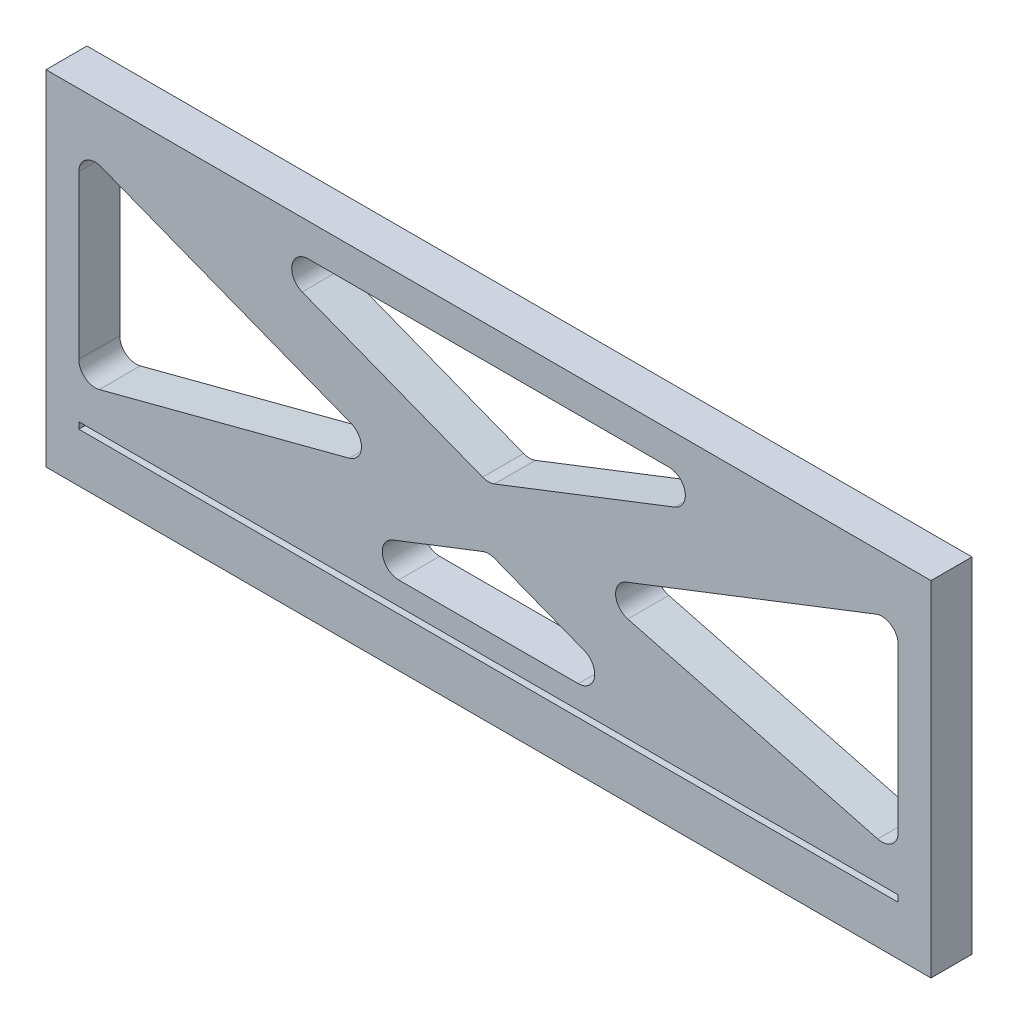
ISO-10303-21;
HEADER;
FILE_DESCRIPTION(('STEP AP214'),'2;1');
FILE_NAME('part.step','',(''),(''),'','','');
FILE_SCHEMA(('AUTOMOTIVE_DESIGN { 1 0 10303 214 1 1 1 1 }'));
ENDSEC;
DATA;
#1=APPLICATION_CONTEXT('core data for automotive mechanical design processes');
#2=APPLICATION_PROTOCOL_DEFINITION('international standard','automotive_design',2000,#1);
#3=PRODUCT_CONTEXT('',#1,'mechanical');
#4=PRODUCT('Part','Part','',(#3));
#5=PRODUCT_RELATED_PRODUCT_CATEGORY('part','',(#4));
#6=PRODUCT_DEFINITION_FORMATION('','',#4);
#7=PRODUCT_DEFINITION_CONTEXT('part definition',#1,'design');
#8=PRODUCT_DEFINITION('design','',#6,#7);
#9=PRODUCT_DEFINITION_SHAPE('','',#8);
#10=(LENGTH_UNIT() NAMED_UNIT(*) SI_UNIT(.MILLI.,.METRE.));
#11=(NAMED_UNIT(*) PLANE_ANGLE_UNIT() SI_UNIT($,.RADIAN.));
#12=(NAMED_UNIT(*) SI_UNIT($,.STERADIAN.) SOLID_ANGLE_UNIT());
#13=UNCERTAINTY_MEASURE_WITH_UNIT(LENGTH_MEASURE(1.E-05),#10,'distance_accuracy_value','');
#14=(GEOMETRIC_REPRESENTATION_CONTEXT(3) GLOBAL_UNCERTAINTY_ASSIGNED_CONTEXT((#13)) GLOBAL_UNIT_ASSIGNED_CONTEXT((#10,
#11,#12)) REPRESENTATION_CONTEXT('',''));
#15=CARTESIAN_POINT('',(0.,0.,0.));
#16=DIRECTION('',(0.,0.,1.));
#17=DIRECTION('',(1.,0.,0.));
#18=AXIS2_PLACEMENT_3D('',#15,#16,#17);
#19=CARTESIAN_POINT('',(0.,0.,3.175));
#20=DIRECTION('',(0.,0.,-1.));
#21=DIRECTION('',(-1.,0.,0.));
#22=AXIS2_PLACEMENT_3D('',#19,#20,#21);
#23=PLANE('',#22);
#24=DIRECTION('',(0.967324913635253,-0.253539960283485,0.));
#25=VECTOR('',#24,1.);
#26=CARTESIAN_POINT('',(31.75,-6.48500000000012,3.175));
#27=LINE('',#26,#25);
#28=CARTESIAN_POINT('',(10.7958958380074,-0.992840476224165,3.175));
#29=VERTEX_POINT('',#28);
#30=CARTESIAN_POINT('',(30.1580042504399,-6.06773116568669,3.175));
#31=VERTEX_POINT('',#30);
#32=EDGE_CURVE('E451',#29,#31,#27,.T.);
#33=ORIENTED_EDGE('',*,*,#32,.F.);
#34=CARTESIAN_POINT('',(11.1178915875674,0.235662164092608,3.175));
#35=DIRECTION('',(0.,0.,-1.));
#36=DIRECTION('',(-1.,0.,0.));
#37=AXIS2_PLACEMENT_3D('',#34,#35,#36);
#38=CIRCLE('',#37,1.27);
#39=CARTESIAN_POINT('',(10.6575848359006,1.41930809695006,3.175));
#40=VERTEX_POINT('',#39);
#41=EDGE_CURVE('E388',#29,#40,#38,.T.);
#42=ORIENTED_EDGE('',*,*,#41,.T.);
#43=DIRECTION('',(-0.932004671541298,-0.362446261154944,0.));
#44=VECTOR('',#43,1.);
#45=CARTESIAN_POINT('',(7.00793544374329,0.,3.175));
#46=LINE('',#45,#44);
#47=CARTESIAN_POINT('',(30.0196932483333,8.94901692400708,3.175));
#48=VERTEX_POINT('',#47);
#49=EDGE_CURVE('E458',#48,#40,#46,.T.);
#50=ORIENTED_EDGE('',*,*,#49,.F.);
#51=CARTESIAN_POINT('',(30.48,7.76537099114963,3.175));
#52=DIRECTION('',(0.,0.,-1.));
#53=DIRECTION('',(-1.,0.,0.));
#54=AXIS2_PLACEMENT_3D('',#51,#52,#53);
#55=CIRCLE('',#54,1.27);
#56=CARTESIAN_POINT('',(31.75,7.76537099114963,3.175));
#57=VERTEX_POINT('',#56);
#58=EDGE_CURVE('E380',#48,#57,#55,.T.);
#59=ORIENTED_EDGE('',*,*,#58,.T.);
#60=DIRECTION('',(0.,1.,0.));
#61=VECTOR('',#60,1.);
#62=CARTESIAN_POINT('',(31.75,9.62191399409971,3.175));
#63=LINE('',#62,#61);
#64=CARTESIAN_POINT('',(31.75,-4.83922852536992,3.175));
#65=VERTEX_POINT('',#64);
#66=EDGE_CURVE('E454',#65,#57,#63,.T.);
#67=ORIENTED_EDGE('',*,*,#66,.F.);
#68=CARTESIAN_POINT('',(30.48,-4.83922852536991,3.175));
#69=DIRECTION('',(0.,0.,-1.));
#70=DIRECTION('',(-1.,0.,0.));
#71=AXIS2_PLACEMENT_3D('',#68,#69,#70);
#72=CIRCLE('',#71,1.27);
#73=EDGE_CURVE('E384',#65,#31,#72,.T.);
#74=ORIENTED_EDGE('',*,*,#73,.T.);
#75=EDGE_LOOP('',(#33,#42,#50,#59,#67,#74));
#76=FACE_BOUND('',#75,.T.);
#77=DIRECTION('',(-1.,0.,0.));
#78=VECTOR('',#77,1.);
#79=CARTESIAN_POINT('',(20.7506359848282,10.795,3.175));
#80=LINE('',#79,#78);
#81=CARTESIAN_POINT('',(13.9809539772422,10.795,3.175));
#82=VERTEX_POINT('',#81);
#83=CARTESIAN_POINT('',(-13.9809539772422,10.795,3.175));
#84=VERTEX_POINT('',#83);
#85=EDGE_CURVE('E487',#82,#84,#80,.T.);
#86=ORIENTED_EDGE('',*,*,#85,.F.);
#87=CARTESIAN_POINT('',(13.9809539772422,9.52500000000001,3.175));
#88=DIRECTION('',(0.,0.,-1.));
#89=DIRECTION('',(-1.,0.,0.));
#90=AXIS2_PLACEMENT_3D('',#87,#88,#89);
#91=CIRCLE('',#90,1.27);
#92=CARTESIAN_POINT('',(14.441260728909,8.34135406714256,3.175));
#93=VERTEX_POINT('',#92);
#94=EDGE_CURVE('E392',#82,#93,#91,.T.);
#95=ORIENTED_EDGE('',*,*,#94,.T.);
#96=DIRECTION('',(0.932004671541296,0.362446261154949,0.));
#97=VECTOR('',#96,1.);
#98=CARTESIAN_POINT('',(0.,2.72530822812238,3.175));
#99=LINE('',#98,#97);
#100=CARTESIAN_POINT('',(0.460306751666785,2.90431640932613,3.175));
#101=VERTEX_POINT('',#100);
#102=EDGE_CURVE('E279',#101,#93,#99,.T.);
#103=ORIENTED_EDGE('',*,*,#102,.F.);
#104=CARTESIAN_POINT('',(0.,4.08796234218358,3.175));
#105=DIRECTION('',(0.,0.,-1.));
#106=DIRECTION('',(-1.,0.,0.));
#107=AXIS2_PLACEMENT_3D('',#104,#105,#106);
#108=CIRCLE('',#107,1.27);
#109=CARTESIAN_POINT('',(-0.460306751666785,2.90431640932613,3.175));
#110=VERTEX_POINT('',#109);
#111=EDGE_CURVE('E400',#101,#110,#108,.T.);
#112=ORIENTED_EDGE('',*,*,#111,.T.);
#113=DIRECTION('',(0.932004671541296,-0.362446261154949,0.));
#114=VECTOR('',#113,1.);
#115=CARTESIAN_POINT('',(-20.7506359848282,10.795,3.175));
#116=LINE('',#115,#114);
#117=CARTESIAN_POINT('',(-14.441260728909,8.34135406714256,3.175));
#118=VERTEX_POINT('',#117);
#119=EDGE_CURVE('E490',#118,#110,#116,.T.);
#120=ORIENTED_EDGE('',*,*,#119,.F.);
#121=CARTESIAN_POINT('',(-13.9809539772422,9.52500000000001,3.175));
#122=DIRECTION('',(0.,0.,-1.));
#123=DIRECTION('',(-1.,0.,0.));
#124=AXIS2_PLACEMENT_3D('',#121,#122,#123);
#125=CIRCLE('',#124,1.27);
#126=EDGE_CURVE('E396',#118,#84,#125,.T.);
#127=ORIENTED_EDGE('',*,*,#126,.T.);
#128=EDGE_LOOP('',(#86,#95,#103,#112,#120,#127));
#129=FACE_BOUND('',#128,.T.);
#130=DIRECTION('',(0.,1.,0.));
#131=VECTOR('',#130,1.);
#132=CARTESIAN_POINT('',(34.29,-13.335,3.175));
#133=LINE('',#132,#131);
#134=CARTESIAN_POINT('',(34.29,-13.335,3.175));
#135=VERTEX_POINT('',#134);
#136=CARTESIAN_POINT('',(34.29,13.335,3.175));
#137=VERTEX_POINT('',#136);
#138=EDGE_CURVE('E290',#135,#137,#133,.T.);
#139=ORIENTED_EDGE('',*,*,#138,.T.);
#140=DIRECTION('',(-1.,0.,0.));
#141=VECTOR('',#140,1.);
#142=CARTESIAN_POINT('',(-34.29,13.335,3.175));
#143=LINE('',#142,#141);
#144=CARTESIAN_POINT('',(-34.29,13.335,3.175));
#145=VERTEX_POINT('',#144);
#146=EDGE_CURVE('E293',#137,#145,#143,.T.);
#147=ORIENTED_EDGE('',*,*,#146,.T.);
#148=DIRECTION('',(0.,-1.,0.));
#149=VECTOR('',#148,1.);
#150=CARTESIAN_POINT('',(-34.29,-13.335,3.175));
#151=LINE('',#150,#149);
#152=CARTESIAN_POINT('',(-34.29,-13.335,3.175));
#153=VERTEX_POINT('',#152);
#154=EDGE_CURVE('E296',#145,#153,#151,.T.);
#155=ORIENTED_EDGE('',*,*,#154,.T.);
#156=DIRECTION('',(1.,0.,0.));
#157=VECTOR('',#156,1.);
#158=CARTESIAN_POINT('',(-34.29,-13.335,3.175));
#159=LINE('',#158,#157);
#160=EDGE_CURVE('E298',#153,#135,#159,.T.);
#161=ORIENTED_EDGE('',*,*,#160,.T.);
#162=EDGE_LOOP('',(#139,#147,#155,#161));
#163=FACE_BOUND('',#162,.T.);
#164=DIRECTION('',(0.,1.,0.));
#165=VECTOR('',#164,1.);
#166=CARTESIAN_POINT('',(31.75,-9.525,3.175));
#167=LINE('',#166,#165);
#168=CARTESIAN_POINT('',(31.75,-9.525,3.175));
#169=VERTEX_POINT('',#168);
#170=CARTESIAN_POINT('',(31.75,-9.025,3.175));
#171=VERTEX_POINT('',#170);
#172=EDGE_CURVE('E246',#169,#171,#167,.T.);
#173=ORIENTED_EDGE('',*,*,#172,.F.);
#174=DIRECTION('',(1.,0.,0.));
#175=VECTOR('',#174,1.);
#176=CARTESIAN_POINT('',(-31.75,-9.525,3.175));
#177=LINE('',#176,#175);
#178=CARTESIAN_POINT('',(-31.75,-9.525,3.175));
#179=VERTEX_POINT('',#178);
#180=EDGE_CURVE('E272',#179,#169,#177,.T.);
#181=ORIENTED_EDGE('',*,*,#180,.F.);
#182=DIRECTION('',(0.,-1.,0.));
#183=VECTOR('',#182,1.);
#184=CARTESIAN_POINT('',(-31.75,-9.525,3.175));
#185=LINE('',#184,#183);
#186=CARTESIAN_POINT('',(-31.75,-9.025,3.175));
#187=VERTEX_POINT('',#186);
#188=EDGE_CURVE('E270',#187,#179,#185,.T.);
#189=ORIENTED_EDGE('',*,*,#188,.F.);
#190=DIRECTION('',(-1.,0.,0.));
#191=VECTOR('',#190,1.);
#192=CARTESIAN_POINT('',(-31.75,-9.025,3.175));
#193=LINE('',#192,#191);
#194=EDGE_CURVE('E256',#171,#187,#193,.T.);
#195=ORIENTED_EDGE('',*,*,#194,.F.);
#196=EDGE_LOOP('',(#173,#181,#189,#195));
#197=FACE_BOUND('',#196,.T.);
#198=DIRECTION('',(-0.932004671541296,0.362446261154948,0.));
#199=VECTOR('',#198,1.);
#200=CARTESIAN_POINT('',(-7.0079354437433,0.,3.175));
#201=LINE('',#200,#199);
#202=CARTESIAN_POINT('',(-10.6575848359006,1.41930809695007,3.175));
#203=VERTEX_POINT('',#202);
#204=CARTESIAN_POINT('',(-30.0196932483332,8.94901692400719,3.175));
#205=VERTEX_POINT('',#204);
#206=EDGE_CURVE('E469',#203,#205,#201,.T.);
#207=ORIENTED_EDGE('',*,*,#206,.F.);
#208=CARTESIAN_POINT('',(-11.1178915875674,0.235662164092626,3.175));
#209=DIRECTION('',(0.,0.,-1.));
#210=DIRECTION('',(-1.,0.,0.));
#211=AXIS2_PLACEMENT_3D('',#208,#209,#210);
#212=CIRCLE('',#211,1.27);
#213=CARTESIAN_POINT('',(-10.7958958380074,-0.992840476224147,3.175));
#214=VERTEX_POINT('',#213);
#215=EDGE_CURVE('E404',#203,#214,#212,.T.);
#216=ORIENTED_EDGE('',*,*,#215,.T.);
#217=DIRECTION('',(0.967324913635254,0.25353996028348,0.));
#218=VECTOR('',#217,1.);
#219=CARTESIAN_POINT('',(-31.75,-6.485,3.175));
#220=LINE('',#219,#218);
#221=CARTESIAN_POINT('',(-30.15800425044,-6.06773116568657,3.175));
#222=VERTEX_POINT('',#221);
#223=EDGE_CURVE('E476',#222,#214,#220,.T.);
#224=ORIENTED_EDGE('',*,*,#223,.F.);
#225=CARTESIAN_POINT('',(-30.48,-4.8392285253698,3.175));
#226=DIRECTION('',(0.,0.,-1.));
#227=DIRECTION('',(-1.,0.,0.));
#228=AXIS2_PLACEMENT_3D('',#225,#226,#227);
#229=CIRCLE('',#228,1.27);
#230=CARTESIAN_POINT('',(-31.75,-4.8392285253698,3.175));
#231=VERTEX_POINT('',#230);
#232=EDGE_CURVE('E412',#222,#231,#229,.T.);
#233=ORIENTED_EDGE('',*,*,#232,.T.);
#234=DIRECTION('',(0.,-1.,0.));
#235=VECTOR('',#234,1.);
#236=CARTESIAN_POINT('',(-31.75,9.62191399409983,3.175));
#237=LINE('',#236,#235);
#238=CARTESIAN_POINT('',(-31.75,7.76537099114975,3.175));
#239=VERTEX_POINT('',#238);
#240=EDGE_CURVE('E472',#239,#231,#237,.T.);
#241=ORIENTED_EDGE('',*,*,#240,.F.);
#242=CARTESIAN_POINT('',(-30.48,7.76537099114975,3.175));
#243=DIRECTION('',(0.,0.,-1.));
#244=DIRECTION('',(-1.,0.,0.));
#245=AXIS2_PLACEMENT_3D('',#242,#243,#244);
#246=CIRCLE('',#245,1.27);
#247=EDGE_CURVE('E408',#239,#205,#246,.T.);
#248=ORIENTED_EDGE('',*,*,#247,.T.);
#249=EDGE_LOOP('',(#207,#216,#224,#233,#241,#248));
#250=FACE_BOUND('',#249,.T.);
#251=DIRECTION('',(-0.932004671541296,0.362446261154948,0.));
#252=VECTOR('',#251,1.);
#253=CARTESIAN_POINT('',(13.7295880465225,-7.247,3.175));
#254=LINE('',#253,#252);
#255=CARTESIAN_POINT('',(7.42021279060341,-4.79335406714255,3.175));
#256=VERTEX_POINT('',#255);
#257=CARTESIAN_POINT('',(0.460306751666787,-2.08672394088942,3.175));
#258=VERTEX_POINT('',#257);
#259=EDGE_CURVE('E435',#256,#258,#254,.T.);
#260=ORIENTED_EDGE('',*,*,#259,.F.);
#261=CARTESIAN_POINT('',(6.95990603893662,-5.97699999999999,3.175));
#262=DIRECTION('',(0.,0.,-1.));
#263=DIRECTION('',(-1.,0.,0.));
#264=AXIS2_PLACEMENT_3D('',#261,#262,#263);
#265=CIRCLE('',#264,1.27);
#266=CARTESIAN_POINT('',(6.95990603893662,-7.247,3.175));
#267=VERTEX_POINT('',#266);
#268=EDGE_CURVE('E416',#256,#267,#265,.T.);
#269=ORIENTED_EDGE('',*,*,#268,.T.);
#270=DIRECTION('',(1.,0.,0.));
#271=VECTOR('',#270,1.);
#272=CARTESIAN_POINT('',(-13.7295880465225,-7.24699999999999,3.175));
#273=LINE('',#272,#271);
#274=CARTESIAN_POINT('',(-6.95990603893662,-7.24699999999999,3.175));
#275=VERTEX_POINT('',#274);
#276=EDGE_CURVE('E440',#275,#267,#273,.T.);
#277=ORIENTED_EDGE('',*,*,#276,.F.);
#278=CARTESIAN_POINT('',(-6.95990603893662,-5.97699999999999,3.175));
#279=DIRECTION('',(0.,0.,-1.));
#280=DIRECTION('',(-1.,0.,0.));
#281=AXIS2_PLACEMENT_3D('',#278,#279,#280);
#282=CIRCLE('',#281,1.27);
#283=CARTESIAN_POINT('',(-7.4202127906034,-4.79335406714255,3.175));
#284=VERTEX_POINT('',#283);
#285=EDGE_CURVE('E11',#275,#284,#282,.T.);
#286=ORIENTED_EDGE('',*,*,#285,.T.);
#287=DIRECTION('',(-0.932004671541296,-0.362446261154948,0.));
#288=VECTOR('',#287,1.);
#289=CARTESIAN_POINT('',(0.,-1.90771575968567,3.175));
#290=LINE('',#289,#288);
#291=CARTESIAN_POINT('',(-0.460306751666785,-2.08672394088942,3.175));
#292=VERTEX_POINT('',#291);
#293=EDGE_CURVE('E438',#292,#284,#290,.T.);
#294=ORIENTED_EDGE('',*,*,#293,.F.);
#295=CARTESIAN_POINT('',(0.,-3.27036987374687,3.175));
#296=DIRECTION('',(0.,0.,-1.));
#297=DIRECTION('',(-1.,0.,0.));
#298=AXIS2_PLACEMENT_3D('',#295,#296,#297);
#299=CIRCLE('',#298,1.27);
#300=EDGE_CURVE('E420',#292,#258,#299,.T.);
#301=ORIENTED_EDGE('',*,*,#300,.T.);
#302=EDGE_LOOP('',(#260,#269,#277,#286,#294,#301));
#303=FACE_BOUND('',#302,.T.);
#304=ADVANCED_FACE('F36',(#76,#129,#163,#197,#250,#303),#23,.F.);
#305=CARTESIAN_POINT('',(0.,0.,0.));
#306=DIRECTION('',(0.,0.,-1.));
#307=DIRECTION('',(-1.,0.,0.));
#308=AXIS2_PLACEMENT_3D('',#305,#306,#307);
#309=PLANE('',#308);
#310=DIRECTION('',(0.,1.,0.));
#311=VECTOR('',#310,1.);
#312=CARTESIAN_POINT('',(34.29,-13.335,0.));
#313=LINE('',#312,#311);
#314=CARTESIAN_POINT('',(34.29,-13.335,0.));
#315=VERTEX_POINT('',#314);
#316=CARTESIAN_POINT('',(34.29,13.335,0.));
#317=VERTEX_POINT('',#316);
#318=EDGE_CURVE('E264',#315,#317,#313,.T.);
#319=ORIENTED_EDGE('',*,*,#318,.F.);
#320=DIRECTION('',(1.,0.,0.));
#321=VECTOR('',#320,1.);
#322=CARTESIAN_POINT('',(-34.29,-13.335,0.));
#323=LINE('',#322,#321);
#324=CARTESIAN_POINT('',(-34.29,-13.335,0.));
#325=VERTEX_POINT('',#324);
#326=EDGE_CURVE('E294',#325,#315,#323,.T.);
#327=ORIENTED_EDGE('',*,*,#326,.F.);
#328=DIRECTION('',(0.,-1.,0.));
#329=VECTOR('',#328,1.);
#330=CARTESIAN_POINT('',(-34.29,-13.335,0.));
#331=LINE('',#330,#329);
#332=CARTESIAN_POINT('',(-34.29,13.335,0.));
#333=VERTEX_POINT('',#332);
#334=EDGE_CURVE('E305',#333,#325,#331,.T.);
#335=ORIENTED_EDGE('',*,*,#334,.F.);
#336=DIRECTION('',(-1.,0.,0.));
#337=VECTOR('',#336,1.);
#338=CARTESIAN_POINT('',(-34.29,13.335,0.));
#339=LINE('',#338,#337);
#340=EDGE_CURVE('E303',#317,#333,#339,.T.);
#341=ORIENTED_EDGE('',*,*,#340,.F.);
#342=EDGE_LOOP('',(#319,#327,#335,#341));
#343=FACE_BOUND('',#342,.T.);
#344=DIRECTION('',(1.,0.,0.));
#345=VECTOR('',#344,1.);
#346=CARTESIAN_POINT('',(-31.75,-9.525,0.));
#347=LINE('',#346,#345);
#348=CARTESIAN_POINT('',(-31.75,-9.525,0.));
#349=VERTEX_POINT('',#348);
#350=CARTESIAN_POINT('',(31.75,-9.525,0.));
#351=VERTEX_POINT('',#350);
#352=EDGE_CURVE('E257',#349,#351,#347,.T.);
#353=ORIENTED_EDGE('',*,*,#352,.T.);
#354=DIRECTION('',(0.,1.,0.));
#355=VECTOR('',#354,1.);
#356=CARTESIAN_POINT('',(31.75,-9.525,0.));
#357=LINE('',#356,#355);
#358=CARTESIAN_POINT('',(31.75,-9.025,0.));
#359=VERTEX_POINT('',#358);
#360=EDGE_CURVE('E277',#351,#359,#357,.T.);
#361=ORIENTED_EDGE('',*,*,#360,.T.);
#362=DIRECTION('',(-1.,0.,0.));
#363=VECTOR('',#362,1.);
#364=CARTESIAN_POINT('',(-31.75,-9.025,0.));
#365=LINE('',#364,#363);
#366=CARTESIAN_POINT('',(-31.75,-9.025,0.));
#367=VERTEX_POINT('',#366);
#368=EDGE_CURVE('E263',#359,#367,#365,.T.);
#369=ORIENTED_EDGE('',*,*,#368,.T.);
#370=DIRECTION('',(0.,-1.,0.));
#371=VECTOR('',#370,1.);
#372=CARTESIAN_POINT('',(-31.75,-9.525,0.));
#373=LINE('',#372,#371);
#374=EDGE_CURVE('E281',#367,#349,#373,.T.);
#375=ORIENTED_EDGE('',*,*,#374,.T.);
#376=EDGE_LOOP('',(#353,#361,#369,#375));
#377=FACE_BOUND('',#376,.T.);
#378=DIRECTION('',(0.932004671541296,-0.362446261154949,0.));
#379=VECTOR('',#378,1.);
#380=CARTESIAN_POINT('',(-20.7506359848282,10.795,0.));
#381=LINE('',#380,#379);
#382=CARTESIAN_POINT('',(-14.441260728909,8.34135406714256,0.));
#383=VERTEX_POINT('',#382);
#384=CARTESIAN_POINT('',(-0.460306751666785,2.90431640932613,0.));
#385=VERTEX_POINT('',#384);
#386=EDGE_CURVE('E498',#383,#385,#381,.T.);
#387=ORIENTED_EDGE('',*,*,#386,.T.);
#388=CARTESIAN_POINT('',(0.,4.08796234218358,0.));
#389=DIRECTION('',(0.,0.,-1.));
#390=DIRECTION('',(-1.,0.,0.));
#391=AXIS2_PLACEMENT_3D('',#388,#389,#390);
#392=CIRCLE('',#391,1.27);
#393=CARTESIAN_POINT('',(0.460306751666785,2.90431640932613,0.));
#394=VERTEX_POINT('',#393);
#395=EDGE_CURVE('E398',#385,#394,#392,.F.);
#396=ORIENTED_EDGE('',*,*,#395,.T.);
#397=DIRECTION('',(0.932004671541296,0.362446261154949,0.));
#398=VECTOR('',#397,1.);
#399=CARTESIAN_POINT('',(0.,2.72530822812238,0.));
#400=LINE('',#399,#398);
#401=CARTESIAN_POINT('',(14.441260728909,8.34135406714256,0.));
#402=VERTEX_POINT('',#401);
#403=EDGE_CURVE('E491',#394,#402,#400,.T.);
#404=ORIENTED_EDGE('',*,*,#403,.T.);
#405=CARTESIAN_POINT('',(13.9809539772422,9.52500000000001,0.));
#406=DIRECTION('',(0.,0.,-1.));
#407=DIRECTION('',(-1.,0.,0.));
#408=AXIS2_PLACEMENT_3D('',#405,#406,#407);
#409=CIRCLE('',#408,1.27);
#410=CARTESIAN_POINT('',(13.9809539772422,10.795,0.));
#411=VERTEX_POINT('',#410);
#412=EDGE_CURVE('E390',#402,#411,#409,.F.);
#413=ORIENTED_EDGE('',*,*,#412,.T.);
#414=DIRECTION('',(-1.,0.,0.));
#415=VECTOR('',#414,1.);
#416=CARTESIAN_POINT('',(20.7506359848282,10.795,0.));
#417=LINE('',#416,#415);
#418=CARTESIAN_POINT('',(-13.9809539772422,10.795,0.));
#419=VERTEX_POINT('',#418);
#420=EDGE_CURVE('E479',#411,#419,#417,.T.);
#421=ORIENTED_EDGE('',*,*,#420,.T.);
#422=CARTESIAN_POINT('',(-13.9809539772422,9.52500000000001,0.));
#423=DIRECTION('',(0.,0.,-1.));
#424=DIRECTION('',(-1.,0.,0.));
#425=AXIS2_PLACEMENT_3D('',#422,#423,#424);
#426=CIRCLE('',#425,1.27);
#427=EDGE_CURVE('E394',#419,#383,#426,.F.);
#428=ORIENTED_EDGE('',*,*,#427,.T.);
#429=EDGE_LOOP('',(#387,#396,#404,#413,#421,#428));
#430=FACE_BOUND('',#429,.T.);
#431=DIRECTION('',(0.,-1.,0.));
#432=VECTOR('',#431,1.);
#433=CARTESIAN_POINT('',(-31.75,9.62191399409983,0.));
#434=LINE('',#433,#432);
#435=CARTESIAN_POINT('',(-31.75,7.76537099114975,0.));
#436=VERTEX_POINT('',#435);
#437=CARTESIAN_POINT('',(-31.75,-4.8392285253698,0.));
#438=VERTEX_POINT('',#437);
#439=EDGE_CURVE('E482',#436,#438,#434,.T.);
#440=ORIENTED_EDGE('',*,*,#439,.T.);
#441=CARTESIAN_POINT('',(-30.48,-4.8392285253698,0.));
#442=DIRECTION('',(0.,0.,-1.));
#443=DIRECTION('',(-1.,0.,0.));
#444=AXIS2_PLACEMENT_3D('',#441,#442,#443);
#445=CIRCLE('',#444,1.27);
#446=CARTESIAN_POINT('',(-30.15800425044,-6.06773116568657,0.));
#447=VERTEX_POINT('',#446);
#448=EDGE_CURVE('E410',#438,#447,#445,.F.);
#449=ORIENTED_EDGE('',*,*,#448,.T.);
#450=DIRECTION('',(0.967324913635254,0.25353996028348,0.));
#451=VECTOR('',#450,1.);
#452=CARTESIAN_POINT('',(-31.75,-6.485,0.));
#453=LINE('',#452,#451);
#454=CARTESIAN_POINT('',(-10.7958958380074,-0.992840476224147,0.));
#455=VERTEX_POINT('',#454);
#456=EDGE_CURVE('E473',#447,#455,#453,.T.);
#457=ORIENTED_EDGE('',*,*,#456,.T.);
#458=CARTESIAN_POINT('',(-11.1178915875674,0.235662164092626,0.));
#459=DIRECTION('',(0.,0.,-1.));
#460=DIRECTION('',(-1.,0.,0.));
#461=AXIS2_PLACEMENT_3D('',#458,#459,#460);
#462=CIRCLE('',#461,1.27);
#463=CARTESIAN_POINT('',(-10.6575848359006,1.41930809695007,0.));
#464=VERTEX_POINT('',#463);
#465=EDGE_CURVE('E402',#455,#464,#462,.F.);
#466=ORIENTED_EDGE('',*,*,#465,.T.);
#467=DIRECTION('',(-0.932004671541296,0.362446261154948,0.));
#468=VECTOR('',#467,1.);
#469=CARTESIAN_POINT('',(-7.0079354437433,0.,0.));
#470=LINE('',#469,#468);
#471=CARTESIAN_POINT('',(-30.0196932483332,8.94901692400719,0.));
#472=VERTEX_POINT('',#471);
#473=EDGE_CURVE('E461',#464,#472,#470,.T.);
#474=ORIENTED_EDGE('',*,*,#473,.T.);
#475=CARTESIAN_POINT('',(-30.48,7.76537099114975,0.));
#476=DIRECTION('',(0.,0.,-1.));
#477=DIRECTION('',(-1.,0.,0.));
#478=AXIS2_PLACEMENT_3D('',#475,#476,#477);
#479=CIRCLE('',#478,1.27);
#480=EDGE_CURVE('E406',#472,#436,#479,.F.);
#481=ORIENTED_EDGE('',*,*,#480,.T.);
#482=EDGE_LOOP('',(#440,#449,#457,#466,#474,#481));
#483=FACE_BOUND('',#482,.T.);
#484=DIRECTION('',(0.,1.,0.));
#485=VECTOR('',#484,1.);
#486=CARTESIAN_POINT('',(31.75,9.62191399409971,0.));
#487=LINE('',#486,#485);
#488=CARTESIAN_POINT('',(31.75,-4.83922852536992,0.));
#489=VERTEX_POINT('',#488);
#490=CARTESIAN_POINT('',(31.75,7.76537099114963,0.));
#491=VERTEX_POINT('',#490);
#492=EDGE_CURVE('E464',#489,#491,#487,.T.);
#493=ORIENTED_EDGE('',*,*,#492,.T.);
#494=CARTESIAN_POINT('',(30.48,7.76537099114963,0.));
#495=DIRECTION('',(0.,0.,-1.));
#496=DIRECTION('',(-1.,0.,0.));
#497=AXIS2_PLACEMENT_3D('',#494,#495,#496);
#498=CIRCLE('',#497,1.27);
#499=CARTESIAN_POINT('',(30.0196932483333,8.94901692400708,0.));
#500=VERTEX_POINT('',#499);
#501=EDGE_CURVE('E378',#491,#500,#498,.F.);
#502=ORIENTED_EDGE('',*,*,#501,.T.);
#503=DIRECTION('',(-0.932004671541298,-0.362446261154944,0.));
#504=VECTOR('',#503,1.);
#505=CARTESIAN_POINT('',(7.00793544374329,0.,0.));
#506=LINE('',#505,#504);
#507=CARTESIAN_POINT('',(10.6575848359006,1.41930809695006,0.));
#508=VERTEX_POINT('',#507);
#509=EDGE_CURVE('E455',#500,#508,#506,.T.);
#510=ORIENTED_EDGE('',*,*,#509,.T.);
#511=CARTESIAN_POINT('',(11.1178915875674,0.235662164092608,0.));
#512=DIRECTION('',(0.,0.,-1.));
#513=DIRECTION('',(-1.,0.,0.));
#514=AXIS2_PLACEMENT_3D('',#511,#512,#513);
#515=CIRCLE('',#514,1.27);
#516=CARTESIAN_POINT('',(10.7958958380074,-0.992840476224165,0.));
#517=VERTEX_POINT('',#516);
#518=EDGE_CURVE('E386',#508,#517,#515,.F.);
#519=ORIENTED_EDGE('',*,*,#518,.T.);
#520=DIRECTION('',(0.967324913635253,-0.253539960283485,0.));
#521=VECTOR('',#520,1.);
#522=CARTESIAN_POINT('',(31.75,-6.48500000000012,0.));
#523=LINE('',#522,#521);
#524=CARTESIAN_POINT('',(30.1580042504399,-6.06773116568669,0.));
#525=VERTEX_POINT('',#524);
#526=EDGE_CURVE('E442',#517,#525,#523,.T.);
#527=ORIENTED_EDGE('',*,*,#526,.T.);
#528=CARTESIAN_POINT('',(30.48,-4.83922852536991,0.));
#529=DIRECTION('',(0.,0.,-1.));
#530=DIRECTION('',(-1.,0.,0.));
#531=AXIS2_PLACEMENT_3D('',#528,#529,#530);
#532=CIRCLE('',#531,1.27);
#533=EDGE_CURVE('E382',#525,#489,#532,.F.);
#534=ORIENTED_EDGE('',*,*,#533,.T.);
#535=EDGE_LOOP('',(#493,#502,#510,#519,#527,#534));
#536=FACE_BOUND('',#535,.T.);
#537=DIRECTION('',(-0.932004671541296,-0.362446261154948,0.));
#538=VECTOR('',#537,1.);
#539=CARTESIAN_POINT('',(0.,-1.90771575968567,0.));
#540=LINE('',#539,#538);
#541=CARTESIAN_POINT('',(-0.460306751666785,-2.08672394088942,0.));
#542=VERTEX_POINT('',#541);
#543=CARTESIAN_POINT('',(-7.4202127906034,-4.79335406714255,0.));
#544=VERTEX_POINT('',#543);
#545=EDGE_CURVE('E427',#542,#544,#540,.T.);
#546=ORIENTED_EDGE('',*,*,#545,.T.);
#547=CARTESIAN_POINT('',(-6.95990603893662,-5.97699999999999,0.));
#548=DIRECTION('',(0.,0.,-1.));
#549=DIRECTION('',(-1.,0.,0.));
#550=AXIS2_PLACEMENT_3D('',#547,#548,#549);
#551=CIRCLE('',#550,1.27);
#552=CARTESIAN_POINT('',(-6.95990603893662,-7.24699999999999,0.));
#553=VERTEX_POINT('',#552);
#554=EDGE_CURVE('E44',#544,#553,#551,.F.);
#555=ORIENTED_EDGE('',*,*,#554,.T.);
#556=DIRECTION('',(1.,0.,0.));
#557=VECTOR('',#556,1.);
#558=CARTESIAN_POINT('',(-13.7295880465225,-7.24699999999999,0.));
#559=LINE('',#558,#557);
#560=CARTESIAN_POINT('',(6.95990603893662,-7.247,0.));
#561=VERTEX_POINT('',#560);
#562=EDGE_CURVE('E426',#553,#561,#559,.T.);
#563=ORIENTED_EDGE('',*,*,#562,.T.);
#564=CARTESIAN_POINT('',(6.95990603893662,-5.97699999999999,0.));
#565=DIRECTION('',(0.,0.,-1.));
#566=DIRECTION('',(-1.,0.,0.));
#567=AXIS2_PLACEMENT_3D('',#564,#565,#566);
#568=CIRCLE('',#567,1.27);
#569=CARTESIAN_POINT('',(7.42021279060341,-4.79335406714255,0.));
#570=VERTEX_POINT('',#569);
#571=EDGE_CURVE('E414',#561,#570,#568,.F.);
#572=ORIENTED_EDGE('',*,*,#571,.T.);
#573=DIRECTION('',(-0.932004671541296,0.362446261154948,0.));
#574=VECTOR('',#573,1.);
#575=CARTESIAN_POINT('',(13.7295880465225,-7.247,0.));
#576=LINE('',#575,#574);
#577=CARTESIAN_POINT('',(0.460306751666787,-2.08672394088942,0.));
#578=VERTEX_POINT('',#577);
#579=EDGE_CURVE('E447',#570,#578,#576,.T.);
#580=ORIENTED_EDGE('',*,*,#579,.T.);
#581=CARTESIAN_POINT('',(0.,-3.27036987374687,0.));
#582=DIRECTION('',(0.,0.,-1.));
#583=DIRECTION('',(-1.,0.,0.));
#584=AXIS2_PLACEMENT_3D('',#581,#582,#583);
#585=CIRCLE('',#584,1.27);
#586=EDGE_CURVE('E418',#578,#542,#585,.F.);
#587=ORIENTED_EDGE('',*,*,#586,.T.);
#588=EDGE_LOOP('',(#546,#555,#563,#572,#580,#587));
#589=FACE_BOUND('',#588,.T.);
#590=ADVANCED_FACE('F425',(#343,#377,#430,#483,#536,#589),#309,.T.);
#591=CARTESIAN_POINT('',(34.29,-13.335,3.175));
#592=DIRECTION('',(-1.,0.,0.));
#593=DIRECTION('',(0.,0.,1.));
#594=AXIS2_PLACEMENT_3D('',#591,#592,#593);
#595=PLANE('',#594);
#596=ORIENTED_EDGE('',*,*,#318,.T.);
#597=DIRECTION('',(0.,0.,-1.));
#598=VECTOR('',#597,1.);
#599=CARTESIAN_POINT('',(34.29,13.335,3.175));
#600=LINE('',#599,#598);
#601=EDGE_CURVE('E316',#137,#317,#600,.T.);
#602=ORIENTED_EDGE('',*,*,#601,.F.);
#603=ORIENTED_EDGE('',*,*,#138,.F.);
#604=DIRECTION('',(0.,0.,-1.));
#605=VECTOR('',#604,1.);
#606=CARTESIAN_POINT('',(34.29,-13.335,3.175));
#607=LINE('',#606,#605);
#608=EDGE_CURVE('E300',#135,#315,#607,.T.);
#609=ORIENTED_EDGE('',*,*,#608,.T.);
#610=EDGE_LOOP('',(#596,#602,#603,#609));
#611=FACE_BOUND('',#610,.T.);
#612=ADVANCED_FACE('F549',(#611),#595,.F.);
#613=CARTESIAN_POINT('',(-34.29,13.335,3.175));
#614=DIRECTION('',(0.,-1.,0.));
#615=DIRECTION('',(0.,0.,-1.));
#616=AXIS2_PLACEMENT_3D('',#613,#614,#615);
#617=PLANE('',#616);
#618=ORIENTED_EDGE('',*,*,#340,.T.);
#619=DIRECTION('',(0.,0.,-1.));
#620=VECTOR('',#619,1.);
#621=CARTESIAN_POINT('',(-34.29,13.335,3.175));
#622=LINE('',#621,#620);
#623=EDGE_CURVE('E313',#145,#333,#622,.T.);
#624=ORIENTED_EDGE('',*,*,#623,.F.);
#625=ORIENTED_EDGE('',*,*,#146,.F.);
#626=ORIENTED_EDGE('',*,*,#601,.T.);
#627=EDGE_LOOP('',(#618,#624,#625,#626));
#628=FACE_BOUND('',#627,.T.);
#629=ADVANCED_FACE('F563',(#628),#617,.F.);
#630=CARTESIAN_POINT('',(-34.29,-13.335,3.175));
#631=DIRECTION('',(1.,0.,0.));
#632=DIRECTION('',(0.,0.,-1.));
#633=AXIS2_PLACEMENT_3D('',#630,#631,#632);
#634=PLANE('',#633);
#635=ORIENTED_EDGE('',*,*,#334,.T.);
#636=DIRECTION('',(0.,0.,-1.));
#637=VECTOR('',#636,1.);
#638=CARTESIAN_POINT('',(-34.29,-13.335,3.175));
#639=LINE('',#638,#637);
#640=EDGE_CURVE('E310',#153,#325,#639,.T.);
#641=ORIENTED_EDGE('',*,*,#640,.F.);
#642=ORIENTED_EDGE('',*,*,#154,.F.);
#643=ORIENTED_EDGE('',*,*,#623,.T.);
#644=EDGE_LOOP('',(#635,#641,#642,#643));
#645=FACE_BOUND('',#644,.T.);
#646=ADVANCED_FACE('F559',(#645),#634,.F.);
#647=CARTESIAN_POINT('',(-34.29,-13.335,3.175));
#648=DIRECTION('',(0.,1.,0.));
#649=DIRECTION('',(-1.,0.,0.));
#650=AXIS2_PLACEMENT_3D('',#647,#648,#649);
#651=PLANE('',#650);
#652=ORIENTED_EDGE('',*,*,#326,.T.);
#653=ORIENTED_EDGE('',*,*,#608,.F.);
#654=ORIENTED_EDGE('',*,*,#160,.F.);
#655=ORIENTED_EDGE('',*,*,#640,.T.);
#656=EDGE_LOOP('',(#652,#653,#654,#655));
#657=FACE_BOUND('',#656,.T.);
#658=ADVANCED_FACE('F556',(#657),#651,.F.);
#659=CARTESIAN_POINT('',(31.75,-9.525,3.175));
#660=DIRECTION('',(-1.,0.,0.));
#661=DIRECTION('',(0.,-1.,0.));
#662=AXIS2_PLACEMENT_3D('',#659,#660,#661);
#663=PLANE('',#662);
#664=ORIENTED_EDGE('',*,*,#360,.F.);
#665=DIRECTION('',(0.,0.,-1.));
#666=VECTOR('',#665,1.);
#667=CARTESIAN_POINT('',(31.75,-9.525,3.175));
#668=LINE('',#667,#666);
#669=EDGE_CURVE('E252',#169,#351,#668,.T.);
#670=ORIENTED_EDGE('',*,*,#669,.F.);
#671=ORIENTED_EDGE('',*,*,#172,.T.);
#672=DIRECTION('',(0.,0.,-1.));
#673=VECTOR('',#672,1.);
#674=CARTESIAN_POINT('',(31.75,-9.025,3.175));
#675=LINE('',#674,#673);
#676=EDGE_CURVE('E249',#171,#359,#675,.T.);
#677=ORIENTED_EDGE('',*,*,#676,.T.);
#678=EDGE_LOOP('',(#664,#670,#671,#677));
#679=FACE_BOUND('',#678,.T.);
#680=ADVANCED_FACE('F248',(#679),#663,.T.);
#681=CARTESIAN_POINT('',(-31.75,-9.025,3.175));
#682=DIRECTION('',(0.,-1.,0.));
#683=DIRECTION('',(0.,0.,-1.));
#684=AXIS2_PLACEMENT_3D('',#681,#682,#683);
#685=PLANE('',#684);
#686=ORIENTED_EDGE('',*,*,#368,.F.);
#687=ORIENTED_EDGE('',*,*,#676,.F.);
#688=ORIENTED_EDGE('',*,*,#194,.T.);
#689=DIRECTION('',(0.,0.,-1.));
#690=VECTOR('',#689,1.);
#691=CARTESIAN_POINT('',(-31.75,-9.025,3.175));
#692=LINE('',#691,#690);
#693=EDGE_CURVE('E265',#187,#367,#692,.T.);
#694=ORIENTED_EDGE('',*,*,#693,.T.);
#695=EDGE_LOOP('',(#686,#687,#688,#694));
#696=FACE_BOUND('',#695,.T.);
#697=ADVANCED_FACE('F260',(#696),#685,.T.);
#698=CARTESIAN_POINT('',(-31.75,-9.525,3.175));
#699=DIRECTION('',(1.,0.,0.));
#700=DIRECTION('',(0.,1.,0.));
#701=AXIS2_PLACEMENT_3D('',#698,#699,#700);
#702=PLANE('',#701);
#703=ORIENTED_EDGE('',*,*,#374,.F.);
#704=ORIENTED_EDGE('',*,*,#693,.F.);
#705=ORIENTED_EDGE('',*,*,#188,.T.);
#706=DIRECTION('',(0.,0.,-1.));
#707=VECTOR('',#706,1.);
#708=CARTESIAN_POINT('',(-31.75,-9.525,3.175));
#709=LINE('',#708,#707);
#710=EDGE_CURVE('E287',#179,#349,#709,.T.);
#711=ORIENTED_EDGE('',*,*,#710,.T.);
#712=EDGE_LOOP('',(#703,#704,#705,#711));
#713=FACE_BOUND('',#712,.T.);
#714=ADVANCED_FACE('F632',(#713),#702,.T.);
#715=CARTESIAN_POINT('',(-31.75,-9.525,3.175));
#716=DIRECTION('',(0.,1.,0.));
#717=DIRECTION('',(0.,0.,1.));
#718=AXIS2_PLACEMENT_3D('',#715,#716,#717);
#719=PLANE('',#718);
#720=ORIENTED_EDGE('',*,*,#352,.F.);
#721=ORIENTED_EDGE('',*,*,#710,.F.);
#722=ORIENTED_EDGE('',*,*,#180,.T.);
#723=ORIENTED_EDGE('',*,*,#669,.T.);
#724=EDGE_LOOP('',(#720,#721,#722,#723));
#725=FACE_BOUND('',#724,.T.);
#726=ADVANCED_FACE('F629',(#725),#719,.T.);
#727=CARTESIAN_POINT('',(20.7506359848282,10.795,3.175));
#728=DIRECTION('',(0.,-1.,0.));
#729=DIRECTION('',(0.,0.,-1.));
#730=AXIS2_PLACEMENT_3D('',#727,#728,#729);
#731=PLANE('',#730);
#732=ORIENTED_EDGE('',*,*,#420,.F.);
#733=DIRECTION('',(0.,0.,-1.));
#734=VECTOR('',#733,1.);
#735=CARTESIAN_POINT('',(13.9809539772422,10.795,3.175));
#736=LINE('',#735,#734);
#737=EDGE_CURVE('E342',#411,#82,#736,.F.);
#738=ORIENTED_EDGE('',*,*,#737,.T.);
#739=ORIENTED_EDGE('',*,*,#85,.T.);
#740=DIRECTION('',(0.,0.,-1.));
#741=VECTOR('',#740,1.);
#742=CARTESIAN_POINT('',(-13.9809539772422,10.795,0.));
#743=LINE('',#742,#741);
#744=EDGE_CURVE('E339',#84,#419,#743,.T.);
#745=ORIENTED_EDGE('',*,*,#744,.T.);
#746=EDGE_LOOP('',(#732,#738,#739,#745));
#747=FACE_BOUND('',#746,.T.);
#748=ADVANCED_FACE('F528',(#747),#731,.T.);
#749=CARTESIAN_POINT('',(-20.7506359848282,10.795,3.175));
#750=DIRECTION('',(0.362446261154949,0.932004671541296,0.));
#751=DIRECTION('',(-0.932004671541296,0.362446261154949,0.));
#752=AXIS2_PLACEMENT_3D('',#749,#750,#751);
#753=PLANE('',#752);
#754=ORIENTED_EDGE('',*,*,#386,.F.);
#755=DIRECTION('',(0.,0.,-1.));
#756=VECTOR('',#755,1.);
#757=CARTESIAN_POINT('',(-14.441260728909,8.34135406714256,3.175));
#758=LINE('',#757,#756);
#759=EDGE_CURVE('E347',#383,#118,#758,.F.);
#760=ORIENTED_EDGE('',*,*,#759,.T.);
#761=ORIENTED_EDGE('',*,*,#119,.T.);
#762=DIRECTION('',(0.,0.,-1.));
#763=VECTOR('',#762,1.);
#764=CARTESIAN_POINT('',(-0.460306751666785,2.90431640932613,0.));
#765=LINE('',#764,#763);
#766=EDGE_CURVE('E344',#110,#385,#765,.T.);
#767=ORIENTED_EDGE('',*,*,#766,.T.);
#768=EDGE_LOOP('',(#754,#760,#761,#767));
#769=FACE_BOUND('',#768,.T.);
#770=ADVANCED_FACE('F521',(#769),#753,.T.);
#771=CARTESIAN_POINT('',(0.,2.72530822812238,3.175));
#772=DIRECTION('',(-0.362446261154949,0.932004671541296,0.));
#773=DIRECTION('',(-0.932004671541296,-0.362446261154949,0.));
#774=AXIS2_PLACEMENT_3D('',#771,#772,#773);
#775=PLANE('',#774);
#776=ORIENTED_EDGE('',*,*,#102,.T.);
#777=DIRECTION('',(0.,0.,-1.));
#778=VECTOR('',#777,1.);
#779=CARTESIAN_POINT('',(14.441260728909,8.34135406714256,0.));
#780=LINE('',#779,#778);
#781=EDGE_CURVE('E336',#93,#402,#780,.T.);
#782=ORIENTED_EDGE('',*,*,#781,.T.);
#783=ORIENTED_EDGE('',*,*,#403,.F.);
#784=DIRECTION('',(0.,0.,-1.));
#785=VECTOR('',#784,1.);
#786=CARTESIAN_POINT('',(0.460306751666785,2.90431640932613,3.175));
#787=LINE('',#786,#785);
#788=EDGE_CURVE('E334',#394,#101,#787,.F.);
#789=ORIENTED_EDGE('',*,*,#788,.T.);
#790=EDGE_LOOP('',(#776,#782,#783,#789));
#791=FACE_BOUND('',#790,.T.);
#792=ADVANCED_FACE('F507',(#791),#775,.T.);
#793=CARTESIAN_POINT('',(-7.0079354437433,0.,3.175));
#794=DIRECTION('',(-0.362446261154948,-0.932004671541296,0.));
#795=DIRECTION('',(0.932004671541296,-0.362446261154948,0.));
#796=AXIS2_PLACEMENT_3D('',#793,#794,#795);
#797=PLANE('',#796);
#798=ORIENTED_EDGE('',*,*,#473,.F.);
#799=DIRECTION('',(0.,0.,-1.));
#800=VECTOR('',#799,1.);
#801=CARTESIAN_POINT('',(-10.6575848359006,1.41930809695007,3.175));
#802=LINE('',#801,#800);
#803=EDGE_CURVE('E357',#464,#203,#802,.F.);
#804=ORIENTED_EDGE('',*,*,#803,.T.);
#805=ORIENTED_EDGE('',*,*,#206,.T.);
#806=DIRECTION('',(0.,0.,-1.));
#807=VECTOR('',#806,1.);
#808=CARTESIAN_POINT('',(-30.0196932483332,8.94901692400719,0.));
#809=LINE('',#808,#807);
#810=EDGE_CURVE('E354',#205,#472,#809,.T.);
#811=ORIENTED_EDGE('',*,*,#810,.T.);
#812=EDGE_LOOP('',(#798,#804,#805,#811));
#813=FACE_BOUND('',#812,.T.);
#814=ADVANCED_FACE('F618',(#813),#797,.T.);
#815=CARTESIAN_POINT('',(-31.75,9.62191399409983,3.175));
#816=DIRECTION('',(1.,0.,0.));
#817=DIRECTION('',(0.,0.,-1.));
#818=AXIS2_PLACEMENT_3D('',#815,#816,#817);
#819=PLANE('',#818);
#820=ORIENTED_EDGE('',*,*,#439,.F.);
#821=DIRECTION('',(0.,0.,-1.));
#822=VECTOR('',#821,1.);
#823=CARTESIAN_POINT('',(-31.75,7.76537099114975,3.175));
#824=LINE('',#823,#822);
#825=EDGE_CURVE('E362',#436,#239,#824,.F.);
#826=ORIENTED_EDGE('',*,*,#825,.T.);
#827=ORIENTED_EDGE('',*,*,#240,.T.);
#828=DIRECTION('',(0.,0.,-1.));
#829=VECTOR('',#828,1.);
#830=CARTESIAN_POINT('',(-31.75,-4.8392285253698,0.));
#831=LINE('',#830,#829);
#832=EDGE_CURVE('E359',#231,#438,#831,.T.);
#833=ORIENTED_EDGE('',*,*,#832,.T.);
#834=EDGE_LOOP('',(#820,#826,#827,#833));
#835=FACE_BOUND('',#834,.T.);
#836=ADVANCED_FACE('F614',(#835),#819,.T.);
#837=CARTESIAN_POINT('',(-31.75,-6.485,3.175));
#838=DIRECTION('',(-0.25353996028348,0.967324913635254,0.));
#839=DIRECTION('',(-0.967324913635254,-0.25353996028348,0.));
#840=AXIS2_PLACEMENT_3D('',#837,#838,#839);
#841=PLANE('',#840);
#842=ORIENTED_EDGE('',*,*,#223,.T.);
#843=DIRECTION('',(0.,0.,-1.));
#844=VECTOR('',#843,1.);
#845=CARTESIAN_POINT('',(-10.7958958380074,-0.992840476224144,0.));
#846=LINE('',#845,#844);
#847=EDGE_CURVE('E351',#214,#455,#846,.T.);
#848=ORIENTED_EDGE('',*,*,#847,.T.);
#849=ORIENTED_EDGE('',*,*,#456,.F.);
#850=DIRECTION('',(0.,0.,-1.));
#851=VECTOR('',#850,1.);
#852=CARTESIAN_POINT('',(-30.15800425044,-6.06773116568657,3.175));
#853=LINE('',#852,#851);
#854=EDGE_CURVE('E349',#447,#222,#853,.F.);
#855=ORIENTED_EDGE('',*,*,#854,.T.);
#856=EDGE_LOOP('',(#842,#848,#849,#855));
#857=FACE_BOUND('',#856,.T.);
#858=ADVANCED_FACE('F608',(#857),#841,.T.);
#859=CARTESIAN_POINT('',(31.75,-6.48500000000012,3.175));
#860=DIRECTION('',(0.253539960283485,0.967324913635253,0.));
#861=DIRECTION('',(-0.967324913635253,0.253539960283485,0.));
#862=AXIS2_PLACEMENT_3D('',#859,#860,#861);
#863=PLANE('',#862);
#864=ORIENTED_EDGE('',*,*,#32,.T.);
#865=DIRECTION('',(0.,0.,-1.));
#866=VECTOR('',#865,1.);
#867=CARTESIAN_POINT('',(30.1580042504399,-6.06773116568669,0.));
#868=LINE('',#867,#866);
#869=EDGE_CURVE('E331',#31,#525,#868,.T.);
#870=ORIENTED_EDGE('',*,*,#869,.T.);
#871=ORIENTED_EDGE('',*,*,#526,.F.);
#872=DIRECTION('',(0.,0.,-1.));
#873=VECTOR('',#872,1.);
#874=CARTESIAN_POINT('',(10.7958958380074,-0.992840476224163,3.175));
#875=LINE('',#874,#873);
#876=EDGE_CURVE('E329',#517,#29,#875,.F.);
#877=ORIENTED_EDGE('',*,*,#876,.T.);
#878=EDGE_LOOP('',(#864,#870,#871,#877));
#879=FACE_BOUND('',#878,.T.);
#880=ADVANCED_FACE('F585',(#879),#863,.T.);
#881=CARTESIAN_POINT('',(31.75,9.62191399409971,3.175));
#882=DIRECTION('',(-1.,0.,0.));
#883=DIRECTION('',(0.,-1.,0.));
#884=AXIS2_PLACEMENT_3D('',#881,#882,#883);
#885=PLANE('',#884);
#886=ORIENTED_EDGE('',*,*,#66,.T.);
#887=DIRECTION('',(0.,0.,-1.));
#888=VECTOR('',#887,1.);
#889=CARTESIAN_POINT('',(31.75,7.76537099114963,0.));
#890=LINE('',#889,#888);
#891=EDGE_CURVE('E321',#57,#491,#890,.T.);
#892=ORIENTED_EDGE('',*,*,#891,.T.);
#893=ORIENTED_EDGE('',*,*,#492,.F.);
#894=DIRECTION('',(0.,0.,-1.));
#895=VECTOR('',#894,1.);
#896=CARTESIAN_POINT('',(31.75,-4.83922852536992,3.175));
#897=LINE('',#896,#895);
#898=EDGE_CURVE('E319',#489,#65,#897,.F.);
#899=ORIENTED_EDGE('',*,*,#898,.T.);
#900=EDGE_LOOP('',(#886,#892,#893,#899));
#901=FACE_BOUND('',#900,.T.);
#902=ADVANCED_FACE('F597',(#901),#885,.T.);
#903=CARTESIAN_POINT('',(7.00793544374329,0.,3.175));
#904=DIRECTION('',(0.362446261154944,-0.932004671541298,0.));
#905=DIRECTION('',(0.932004671541298,0.362446261154944,0.));
#906=AXIS2_PLACEMENT_3D('',#903,#904,#905);
#907=PLANE('',#906);
#908=ORIENTED_EDGE('',*,*,#509,.F.);
#909=DIRECTION('',(0.,0.,-1.));
#910=VECTOR('',#909,1.);
#911=CARTESIAN_POINT('',(30.0196932483333,8.94901692400708,3.175));
#912=LINE('',#911,#910);
#913=EDGE_CURVE('E327',#500,#48,#912,.F.);
#914=ORIENTED_EDGE('',*,*,#913,.T.);
#915=ORIENTED_EDGE('',*,*,#49,.T.);
#916=DIRECTION('',(0.,0.,-1.));
#917=VECTOR('',#916,1.);
#918=CARTESIAN_POINT('',(10.6575848359006,1.41930809695006,0.));
#919=LINE('',#918,#917);
#920=EDGE_CURVE('E324',#40,#508,#919,.T.);
#921=ORIENTED_EDGE('',*,*,#920,.T.);
#922=EDGE_LOOP('',(#908,#914,#915,#921));
#923=FACE_BOUND('',#922,.T.);
#924=ADVANCED_FACE('F593',(#923),#907,.T.);
#925=CARTESIAN_POINT('',(13.7295880465225,-7.247,3.175));
#926=DIRECTION('',(-0.362446261154948,-0.932004671541296,0.));
#927=DIRECTION('',(0.932004671541296,-0.362446261154948,0.));
#928=AXIS2_PLACEMENT_3D('',#925,#926,#927);
#929=PLANE('',#928);
#930=ORIENTED_EDGE('',*,*,#579,.F.);
#931=DIRECTION('',(0.,0.,-1.));
#932=VECTOR('',#931,1.);
#933=CARTESIAN_POINT('',(7.42021279060341,-4.79335406714255,3.175));
#934=LINE('',#933,#932);
#935=EDGE_CURVE('E372',#570,#256,#934,.F.);
#936=ORIENTED_EDGE('',*,*,#935,.T.);
#937=ORIENTED_EDGE('',*,*,#259,.T.);
#938=DIRECTION('',(0.,0.,-1.));
#939=VECTOR('',#938,1.);
#940=CARTESIAN_POINT('',(0.460306751666785,-2.08672394088942,0.));
#941=LINE('',#940,#939);
#942=EDGE_CURVE('E369',#258,#578,#941,.T.);
#943=ORIENTED_EDGE('',*,*,#942,.T.);
#944=EDGE_LOOP('',(#930,#936,#937,#943));
#945=FACE_BOUND('',#944,.T.);
#946=ADVANCED_FACE('F606',(#945),#929,.T.);
#947=CARTESIAN_POINT('',(0.,-1.90771575968567,3.175));
#948=DIRECTION('',(0.362446261154948,-0.932004671541296,0.));
#949=DIRECTION('',(0.932004671541296,0.362446261154948,0.));
#950=AXIS2_PLACEMENT_3D('',#947,#948,#949);
#951=PLANE('',#950);
#952=ORIENTED_EDGE('',*,*,#545,.F.);
#953=DIRECTION('',(0.,0.,-1.));
#954=VECTOR('',#953,1.);
#955=CARTESIAN_POINT('',(-0.460306751666785,-2.08672394088942,3.175));
#956=LINE('',#955,#954);
#957=EDGE_CURVE('E56',#542,#292,#956,.F.);
#958=ORIENTED_EDGE('',*,*,#957,.T.);
#959=ORIENTED_EDGE('',*,*,#293,.T.);
#960=DIRECTION('',(0.,0.,-1.));
#961=VECTOR('',#960,1.);
#962=CARTESIAN_POINT('',(-7.4202127906034,-4.79335406714255,0.));
#963=LINE('',#962,#961);
#964=EDGE_CURVE('E374',#284,#544,#963,.T.);
#965=ORIENTED_EDGE('',*,*,#964,.T.);
#966=EDGE_LOOP('',(#952,#958,#959,#965));
#967=FACE_BOUND('',#966,.T.);
#968=ADVANCED_FACE('F437',(#967),#951,.T.);
#969=CARTESIAN_POINT('',(-13.7295880465225,-7.24699999999999,3.175));
#970=DIRECTION('',(0.,1.,0.));
#971=DIRECTION('',(-1.,0.,0.));
#972=AXIS2_PLACEMENT_3D('',#969,#970,#971);
#973=PLANE('',#972);
#974=ORIENTED_EDGE('',*,*,#276,.T.);
#975=DIRECTION('',(0.,0.,-1.));
#976=VECTOR('',#975,1.);
#977=CARTESIAN_POINT('',(6.95990603893662,-7.247,0.));
#978=LINE('',#977,#976);
#979=EDGE_CURVE('E366',#267,#561,#978,.T.);
#980=ORIENTED_EDGE('',*,*,#979,.T.);
#981=ORIENTED_EDGE('',*,*,#562,.F.);
#982=DIRECTION('',(0.,0.,-1.));
#983=VECTOR('',#982,1.);
#984=CARTESIAN_POINT('',(-6.95990603893662,-7.24699999999999,3.175));
#985=LINE('',#984,#983);
#986=EDGE_CURVE('E364',#553,#275,#985,.F.);
#987=ORIENTED_EDGE('',*,*,#986,.T.);
#988=EDGE_LOOP('',(#974,#980,#981,#987));
#989=FACE_BOUND('',#988,.T.);
#990=ADVANCED_FACE('F433',(#989),#973,.T.);
#991=CARTESIAN_POINT('',(30.48,7.76537099114963,3.175));
#992=DIRECTION('',(0.,0.,1.));
#993=DIRECTION('',(1.,0.,0.));
#994=AXIS2_PLACEMENT_3D('',#991,#992,#993);
#995=CYLINDRICAL_SURFACE('',#994,1.27);
#996=ORIENTED_EDGE('',*,*,#58,.F.);
#997=ORIENTED_EDGE('',*,*,#913,.F.);
#998=ORIENTED_EDGE('',*,*,#501,.F.);
#999=ORIENTED_EDGE('',*,*,#891,.F.);
#1000=EDGE_LOOP('',(#996,#997,#998,#999));
#1001=FACE_BOUND('',#1000,.T.);
#1002=ADVANCED_FACE('F571',(#1001),#995,.F.);
#1003=CARTESIAN_POINT('',(30.48,-4.83922852536991,3.175));
#1004=DIRECTION('',(0.,0.,1.));
#1005=DIRECTION('',(1.,0.,0.));
#1006=AXIS2_PLACEMENT_3D('',#1003,#1004,#1005);
#1007=CYLINDRICAL_SURFACE('',#1006,1.27);
#1008=ORIENTED_EDGE('',*,*,#73,.F.);
#1009=ORIENTED_EDGE('',*,*,#898,.F.);
#1010=ORIENTED_EDGE('',*,*,#533,.F.);
#1011=ORIENTED_EDGE('',*,*,#869,.F.);
#1012=EDGE_LOOP('',(#1008,#1009,#1010,#1011));
#1013=FACE_BOUND('',#1012,.T.);
#1014=ADVANCED_FACE('F540',(#1013),#1007,.F.);
#1015=CARTESIAN_POINT('',(11.1178915875674,0.235662164092608,3.175));
#1016=DIRECTION('',(0.,0.,1.));
#1017=DIRECTION('',(1.,0.,0.));
#1018=AXIS2_PLACEMENT_3D('',#1015,#1016,#1017);
#1019=CYLINDRICAL_SURFACE('',#1018,1.27);
#1020=ORIENTED_EDGE('',*,*,#41,.F.);
#1021=ORIENTED_EDGE('',*,*,#876,.F.);
#1022=ORIENTED_EDGE('',*,*,#518,.F.);
#1023=ORIENTED_EDGE('',*,*,#920,.F.);
#1024=EDGE_LOOP('',(#1020,#1021,#1022,#1023));
#1025=FACE_BOUND('',#1024,.T.);
#1026=ADVANCED_FACE('F533',(#1025),#1019,.F.);
#1027=CARTESIAN_POINT('',(13.9809539772422,9.52500000000001,3.175));
#1028=DIRECTION('',(0.,0.,1.));
#1029=DIRECTION('',(1.,0.,0.));
#1030=AXIS2_PLACEMENT_3D('',#1027,#1028,#1029);
#1031=CYLINDRICAL_SURFACE('',#1030,1.27);
#1032=ORIENTED_EDGE('',*,*,#94,.F.);
#1033=ORIENTED_EDGE('',*,*,#737,.F.);
#1034=ORIENTED_EDGE('',*,*,#412,.F.);
#1035=ORIENTED_EDGE('',*,*,#781,.F.);
#1036=EDGE_LOOP('',(#1032,#1033,#1034,#1035));
#1037=FACE_BOUND('',#1036,.T.);
#1038=ADVANCED_FACE('F531',(#1037),#1031,.F.);
#1039=CARTESIAN_POINT('',(-13.9809539772422,9.52500000000001,3.175));
#1040=DIRECTION('',(0.,0.,1.));
#1041=DIRECTION('',(1.,0.,0.));
#1042=AXIS2_PLACEMENT_3D('',#1039,#1040,#1041);
#1043=CYLINDRICAL_SURFACE('',#1042,1.27);
#1044=ORIENTED_EDGE('',*,*,#126,.F.);
#1045=ORIENTED_EDGE('',*,*,#759,.F.);
#1046=ORIENTED_EDGE('',*,*,#427,.F.);
#1047=ORIENTED_EDGE('',*,*,#744,.F.);
#1048=EDGE_LOOP('',(#1044,#1045,#1046,#1047));
#1049=FACE_BOUND('',#1048,.T.);
#1050=ADVANCED_FACE('F524',(#1049),#1043,.F.);
#1051=CARTESIAN_POINT('',(0.,4.08796234218358,3.175));
#1052=DIRECTION('',(0.,0.,1.));
#1053=DIRECTION('',(1.,0.,0.));
#1054=AXIS2_PLACEMENT_3D('',#1051,#1052,#1053);
#1055=CYLINDRICAL_SURFACE('',#1054,1.27);
#1056=ORIENTED_EDGE('',*,*,#111,.F.);
#1057=ORIENTED_EDGE('',*,*,#788,.F.);
#1058=ORIENTED_EDGE('',*,*,#395,.F.);
#1059=ORIENTED_EDGE('',*,*,#766,.F.);
#1060=EDGE_LOOP('',(#1056,#1057,#1058,#1059));
#1061=FACE_BOUND('',#1060,.T.);
#1062=ADVANCED_FACE('F512',(#1061),#1055,.F.);
#1063=CARTESIAN_POINT('',(-11.1178915875674,0.235662164092626,3.175));
#1064=DIRECTION('',(0.,0.,1.));
#1065=DIRECTION('',(1.,0.,0.));
#1066=AXIS2_PLACEMENT_3D('',#1063,#1064,#1065);
#1067=CYLINDRICAL_SURFACE('',#1066,1.27);
#1068=ORIENTED_EDGE('',*,*,#215,.F.);
#1069=ORIENTED_EDGE('',*,*,#803,.F.);
#1070=ORIENTED_EDGE('',*,*,#465,.F.);
#1071=ORIENTED_EDGE('',*,*,#847,.F.);
#1072=EDGE_LOOP('',(#1068,#1069,#1070,#1071));
#1073=FACE_BOUND('',#1072,.T.);
#1074=ADVANCED_FACE('F777',(#1073),#1067,.F.);
#1075=CARTESIAN_POINT('',(-30.48,7.76537099114975,3.175));
#1076=DIRECTION('',(0.,0.,1.));
#1077=DIRECTION('',(1.,0.,0.));
#1078=AXIS2_PLACEMENT_3D('',#1075,#1076,#1077);
#1079=CYLINDRICAL_SURFACE('',#1078,1.27);
#1080=ORIENTED_EDGE('',*,*,#247,.F.);
#1081=ORIENTED_EDGE('',*,*,#825,.F.);
#1082=ORIENTED_EDGE('',*,*,#480,.F.);
#1083=ORIENTED_EDGE('',*,*,#810,.F.);
#1084=EDGE_LOOP('',(#1080,#1081,#1082,#1083));
#1085=FACE_BOUND('',#1084,.T.);
#1086=ADVANCED_FACE('F786',(#1085),#1079,.F.);
#1087=CARTESIAN_POINT('',(-30.48,-4.8392285253698,3.175));
#1088=DIRECTION('',(0.,0.,1.));
#1089=DIRECTION('',(1.,0.,0.));
#1090=AXIS2_PLACEMENT_3D('',#1087,#1088,#1089);
#1091=CYLINDRICAL_SURFACE('',#1090,1.27);
#1092=ORIENTED_EDGE('',*,*,#232,.F.);
#1093=ORIENTED_EDGE('',*,*,#854,.F.);
#1094=ORIENTED_EDGE('',*,*,#448,.F.);
#1095=ORIENTED_EDGE('',*,*,#832,.F.);
#1096=EDGE_LOOP('',(#1092,#1093,#1094,#1095));
#1097=FACE_BOUND('',#1096,.T.);
#1098=ADVANCED_FACE('F796',(#1097),#1091,.F.);
#1099=CARTESIAN_POINT('',(6.95990603893662,-5.97699999999999,3.175));
#1100=DIRECTION('',(0.,0.,1.));
#1101=DIRECTION('',(1.,0.,0.));
#1102=AXIS2_PLACEMENT_3D('',#1099,#1100,#1101);
#1103=CYLINDRICAL_SURFACE('',#1102,1.27);
#1104=ORIENTED_EDGE('',*,*,#268,.F.);
#1105=ORIENTED_EDGE('',*,*,#935,.F.);
#1106=ORIENTED_EDGE('',*,*,#571,.F.);
#1107=ORIENTED_EDGE('',*,*,#979,.F.);
#1108=EDGE_LOOP('',(#1104,#1105,#1106,#1107));
#1109=FACE_BOUND('',#1108,.T.);
#1110=ADVANCED_FACE('F806',(#1109),#1103,.F.);
#1111=CARTESIAN_POINT('',(0.,-3.27036987374687,3.175));
#1112=DIRECTION('',(0.,0.,1.));
#1113=DIRECTION('',(1.,0.,0.));
#1114=AXIS2_PLACEMENT_3D('',#1111,#1112,#1113);
#1115=CYLINDRICAL_SURFACE('',#1114,1.27);
#1116=ORIENTED_EDGE('',*,*,#300,.F.);
#1117=ORIENTED_EDGE('',*,*,#957,.F.);
#1118=ORIENTED_EDGE('',*,*,#586,.F.);
#1119=ORIENTED_EDGE('',*,*,#942,.F.);
#1120=EDGE_LOOP('',(#1116,#1117,#1118,#1119));
#1121=FACE_BOUND('',#1120,.T.);
#1122=ADVANCED_FACE('F816',(#1121),#1115,.F.);
#1123=CARTESIAN_POINT('',(-6.95990603893662,-5.97699999999999,3.175));
#1124=DIRECTION('',(0.,0.,1.));
#1125=DIRECTION('',(1.,0.,0.));
#1126=AXIS2_PLACEMENT_3D('',#1123,#1124,#1125);
#1127=CYLINDRICAL_SURFACE('',#1126,1.27);
#1128=ORIENTED_EDGE('',*,*,#285,.F.);
#1129=ORIENTED_EDGE('',*,*,#986,.F.);
#1130=ORIENTED_EDGE('',*,*,#554,.F.);
#1131=ORIENTED_EDGE('',*,*,#964,.F.);
#1132=EDGE_LOOP('',(#1128,#1129,#1130,#1131));
#1133=FACE_BOUND('',#1132,.T.);
#1134=ADVANCED_FACE('F38',(#1133),#1127,.F.);
#1135=CLOSED_SHELL('',(#304,#590,#612,#629,#646,#658,#680,#697,#714,#726,#748,#770,#792,#814,
#836,#858,#880,#902,#924,#946,#968,#990,#1002,#1014,#1026,#1038,#1050,#1062,#1074,#1086,#1098,
#1110,#1122,#1134));
#1136=MANIFOLD_SOLID_BREP('B2',#1135);
#1137=ADVANCED_BREP_SHAPE_REPRESENTATION('',(#18,#1136),#14);
#1138=SHAPE_DEFINITION_REPRESENTATION(#9,#1137);
ENDSEC;
END-ISO-10303-21;
